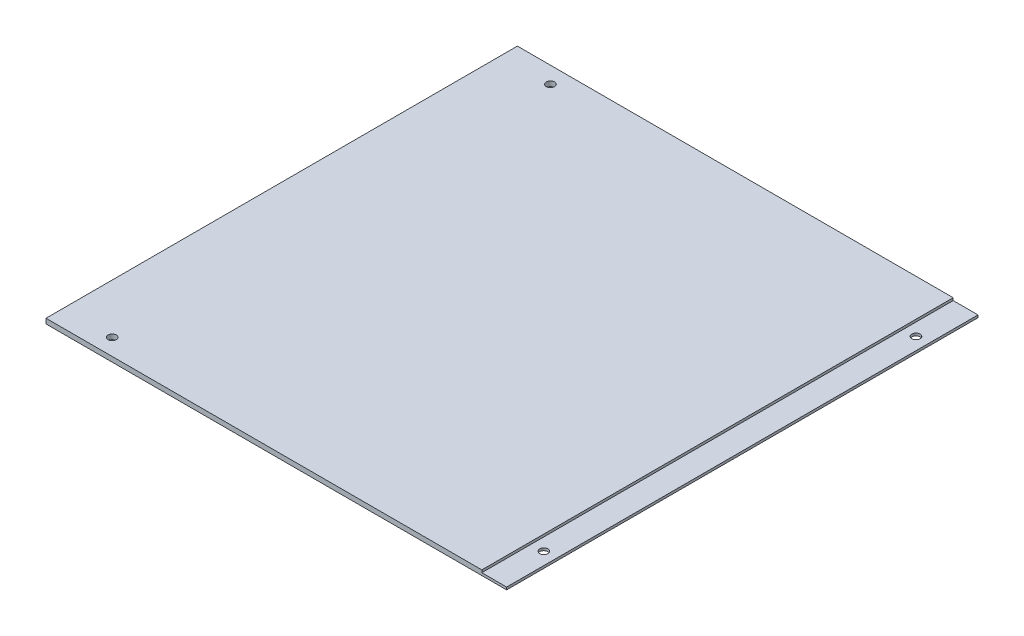
ISO-10303-21;
HEADER;
FILE_DESCRIPTION(('STEP AP214'),'2;1');
FILE_NAME('part.step','',(''),(''),'','','');
FILE_SCHEMA(('AUTOMOTIVE_DESIGN { 1 0 10303 214 1 1 1 1 }'));
ENDSEC;
DATA;
#1=APPLICATION_CONTEXT('core data for automotive mechanical design processes');
#2=APPLICATION_PROTOCOL_DEFINITION('international standard','automotive_design',2000,#1);
#3=PRODUCT_CONTEXT('',#1,'mechanical');
#4=PRODUCT('Part','Part','',(#3));
#5=PRODUCT_RELATED_PRODUCT_CATEGORY('part','',(#4));
#6=PRODUCT_DEFINITION_FORMATION('','',#4);
#7=PRODUCT_DEFINITION_CONTEXT('part definition',#1,'design');
#8=PRODUCT_DEFINITION('design','',#6,#7);
#9=PRODUCT_DEFINITION_SHAPE('','',#8);
#10=(LENGTH_UNIT() NAMED_UNIT(*) SI_UNIT(.MILLI.,.METRE.));
#11=(NAMED_UNIT(*) PLANE_ANGLE_UNIT() SI_UNIT($,.RADIAN.));
#12=(NAMED_UNIT(*) SI_UNIT($,.STERADIAN.) SOLID_ANGLE_UNIT());
#13=UNCERTAINTY_MEASURE_WITH_UNIT(LENGTH_MEASURE(1.E-05),#10,'distance_accuracy_value','');
#14=(GEOMETRIC_REPRESENTATION_CONTEXT(3) GLOBAL_UNCERTAINTY_ASSIGNED_CONTEXT((#13)) GLOBAL_UNIT_ASSIGNED_CONTEXT((#10,
#11,#12)) REPRESENTATION_CONTEXT('',''));
#15=CARTESIAN_POINT('',(0.,0.,0.));
#16=DIRECTION('',(0.,0.,1.));
#17=DIRECTION('',(1.,0.,0.));
#18=AXIS2_PLACEMENT_3D('',#15,#16,#17);
#19=CARTESIAN_POINT('',(139.25,3.,-142.5));
#20=DIRECTION('',(-1.,0.,0.));
#21=DIRECTION('',(0.,0.,1.));
#22=AXIS2_PLACEMENT_3D('',#19,#20,#21);
#23=PLANE('',#22);
#24=DIRECTION('',(0.,-1.,0.));
#25=VECTOR('',#24,1.);
#26=CARTESIAN_POINT('',(139.25,3.,-142.5));
#27=LINE('',#26,#25);
#28=CARTESIAN_POINT('',(139.25,1.5,-142.5));
#29=VERTEX_POINT('',#28);
#30=CARTESIAN_POINT('',(139.25,0.,-142.5));
#31=VERTEX_POINT('',#30);
#32=EDGE_CURVE('E11',#29,#31,#27,.T.);
#33=ORIENTED_EDGE('',*,*,#32,.F.);
#34=DIRECTION('',(0.,0.,1.));
#35=VECTOR('',#34,1.);
#36=CARTESIAN_POINT('',(139.25,1.5,-142.5));
#37=LINE('',#36,#35);
#38=CARTESIAN_POINT('',(139.25,1.5,142.5));
#39=VERTEX_POINT('',#38);
#40=EDGE_CURVE('E82',#29,#39,#37,.T.);
#41=ORIENTED_EDGE('',*,*,#40,.T.);
#42=DIRECTION('',(0.,-1.,0.));
#43=VECTOR('',#42,1.);
#44=CARTESIAN_POINT('',(139.25,3.,142.5));
#45=LINE('',#44,#43);
#46=CARTESIAN_POINT('',(139.25,0.,142.5));
#47=VERTEX_POINT('',#46);
#48=EDGE_CURVE('E75',#39,#47,#45,.T.);
#49=ORIENTED_EDGE('',*,*,#48,.T.);
#50=DIRECTION('',(0.,0.,-1.));
#51=VECTOR('',#50,1.);
#52=CARTESIAN_POINT('',(139.25,0.,-142.5));
#53=LINE('',#52,#51);
#54=EDGE_CURVE('E79',#47,#31,#53,.T.);
#55=ORIENTED_EDGE('',*,*,#54,.T.);
#56=EDGE_LOOP('',(#33,#41,#49,#55));
#57=FACE_BOUND('',#56,.T.);
#58=ADVANCED_FACE('F33',(#57),#23,.F.);
#59=CARTESIAN_POINT('',(-139.25,3.,-142.5));
#60=DIRECTION('',(0.,0.,1.));
#61=DIRECTION('',(1.,0.,0.));
#62=AXIS2_PLACEMENT_3D('',#59,#60,#61);
#63=PLANE('',#62);
#64=DIRECTION('',(0.,-1.,0.));
#65=VECTOR('',#64,1.);
#66=CARTESIAN_POINT('',(124.25,1.5,-142.5));
#67=LINE('',#66,#65);
#68=CARTESIAN_POINT('',(124.25,3.,-142.5));
#69=VERTEX_POINT('',#68);
#70=CARTESIAN_POINT('',(124.25,1.5,-142.5));
#71=VERTEX_POINT('',#70);
#72=EDGE_CURVE('E47',#69,#71,#67,.T.);
#73=ORIENTED_EDGE('',*,*,#72,.T.);
#74=DIRECTION('',(1.,0.,0.));
#75=VECTOR('',#74,1.);
#76=CARTESIAN_POINT('',(139.25,1.5,-142.5));
#77=LINE('',#76,#75);
#78=EDGE_CURVE('E118',#71,#29,#77,.T.);
#79=ORIENTED_EDGE('',*,*,#78,.T.);
#80=ORIENTED_EDGE('',*,*,#32,.T.);
#81=DIRECTION('',(-1.,0.,0.));
#82=VECTOR('',#81,1.);
#83=CARTESIAN_POINT('',(-139.25,0.,-142.5));
#84=LINE('',#83,#82);
#85=CARTESIAN_POINT('',(-139.25,0.,-142.5));
#86=VERTEX_POINT('',#85);
#87=EDGE_CURVE('E100',#31,#86,#84,.T.);
#88=ORIENTED_EDGE('',*,*,#87,.T.);
#89=DIRECTION('',(0.,-1.,0.));
#90=VECTOR('',#89,1.);
#91=CARTESIAN_POINT('',(-139.25,3.,-142.5));
#92=LINE('',#91,#90);
#93=CARTESIAN_POINT('',(-139.25,3.,-142.5));
#94=VERTEX_POINT('',#93);
#95=EDGE_CURVE('E40',#94,#86,#92,.T.);
#96=ORIENTED_EDGE('',*,*,#95,.F.);
#97=DIRECTION('',(-1.,0.,0.));
#98=VECTOR('',#97,1.);
#99=CARTESIAN_POINT('',(-139.25,3.,-142.5));
#100=LINE('',#99,#98);
#101=EDGE_CURVE('E95',#69,#94,#100,.T.);
#102=ORIENTED_EDGE('',*,*,#101,.F.);
#103=EDGE_LOOP('',(#73,#79,#80,#88,#96,#102));
#104=FACE_BOUND('',#103,.T.);
#105=ADVANCED_FACE('F115',(#104),#63,.F.);
#106=CARTESIAN_POINT('',(-139.25,3.,-142.5));
#107=DIRECTION('',(1.,0.,0.));
#108=DIRECTION('',(0.,0.,-1.));
#109=AXIS2_PLACEMENT_3D('',#106,#107,#108);
#110=PLANE('',#109);
#111=DIRECTION('',(0.,0.,1.));
#112=VECTOR('',#111,1.);
#113=CARTESIAN_POINT('',(-139.25,0.,-142.5));
#114=LINE('',#113,#112);
#115=CARTESIAN_POINT('',(-139.25,0.,142.5));
#116=VERTEX_POINT('',#115);
#117=EDGE_CURVE('E96',#86,#116,#114,.T.);
#118=ORIENTED_EDGE('',*,*,#117,.T.);
#119=DIRECTION('',(0.,-1.,0.));
#120=VECTOR('',#119,1.);
#121=CARTESIAN_POINT('',(-139.25,3.,142.5));
#122=LINE('',#121,#120);
#123=CARTESIAN_POINT('',(-139.25,3.,142.5));
#124=VERTEX_POINT('',#123);
#125=EDGE_CURVE('E85',#124,#116,#122,.T.);
#126=ORIENTED_EDGE('',*,*,#125,.F.);
#127=DIRECTION('',(0.,0.,1.));
#128=VECTOR('',#127,1.);
#129=CARTESIAN_POINT('',(-139.25,3.,-142.5));
#130=LINE('',#129,#128);
#131=EDGE_CURVE('E56',#94,#124,#130,.T.);
#132=ORIENTED_EDGE('',*,*,#131,.F.);
#133=ORIENTED_EDGE('',*,*,#95,.T.);
#134=EDGE_LOOP('',(#118,#126,#132,#133));
#135=FACE_BOUND('',#134,.T.);
#136=ADVANCED_FACE('F112',(#135),#110,.F.);
#137=CARTESIAN_POINT('',(-139.25,3.,142.5));
#138=DIRECTION('',(0.,0.,-1.));
#139=DIRECTION('',(-1.,0.,0.));
#140=AXIS2_PLACEMENT_3D('',#137,#138,#139);
#141=PLANE('',#140);
#142=ORIENTED_EDGE('',*,*,#48,.F.);
#143=DIRECTION('',(1.,0.,0.));
#144=VECTOR('',#143,1.);
#145=CARTESIAN_POINT('',(139.25,1.5,142.5));
#146=LINE('',#145,#144);
#147=CARTESIAN_POINT('',(124.25,1.5,142.5));
#148=VERTEX_POINT('',#147);
#149=EDGE_CURVE('E129',#148,#39,#146,.T.);
#150=ORIENTED_EDGE('',*,*,#149,.F.);
#151=DIRECTION('',(0.,-1.,0.));
#152=VECTOR('',#151,1.);
#153=CARTESIAN_POINT('',(124.25,1.5,142.5));
#154=LINE('',#153,#152);
#155=CARTESIAN_POINT('',(124.25,3.,142.5));
#156=VERTEX_POINT('',#155);
#157=EDGE_CURVE('E133',#156,#148,#154,.T.);
#158=ORIENTED_EDGE('',*,*,#157,.F.);
#159=DIRECTION('',(1.,0.,0.));
#160=VECTOR('',#159,1.);
#161=CARTESIAN_POINT('',(-139.25,3.,142.5));
#162=LINE('',#161,#160);
#163=EDGE_CURVE('E86',#124,#156,#162,.T.);
#164=ORIENTED_EDGE('',*,*,#163,.F.);
#165=ORIENTED_EDGE('',*,*,#125,.T.);
#166=DIRECTION('',(1.,0.,0.));
#167=VECTOR('',#166,1.);
#168=CARTESIAN_POINT('',(-139.25,0.,142.5));
#169=LINE('',#168,#167);
#170=EDGE_CURVE('E90',#116,#47,#169,.T.);
#171=ORIENTED_EDGE('',*,*,#170,.T.);
#172=EDGE_LOOP('',(#142,#150,#158,#164,#165,#171));
#173=FACE_BOUND('',#172,.T.);
#174=ADVANCED_FACE('F91',(#173),#141,.F.);
#175=CARTESIAN_POINT('',(0.,3.,0.));
#176=DIRECTION('',(0.,1.,0.));
#177=DIRECTION('',(0.,0.,1.));
#178=AXIS2_PLACEMENT_3D('',#175,#176,#177);
#179=PLANE('',#178);
#180=CARTESIAN_POINT('',(-109.25,3.,-132.5));
#181=DIRECTION('',(0.,1.,0.));
#182=DIRECTION('',(0.,0.,1.));
#183=AXIS2_PLACEMENT_3D('',#180,#181,#182);
#184=CIRCLE('',#183,2.50000000000001);
#185=CARTESIAN_POINT('',(-109.25,3.,-135.));
#186=VERTEX_POINT('',#185);
#187=EDGE_CURVE('E153',#186,#186,#184,.F.);
#188=ORIENTED_EDGE('',*,*,#187,.T.);
#189=EDGE_LOOP('',(#188));
#190=FACE_BOUND('',#189,.T.);
#191=CARTESIAN_POINT('',(-109.25,3.,132.5));
#192=DIRECTION('',(0.,1.,0.));
#193=DIRECTION('',(0.,0.,1.));
#194=AXIS2_PLACEMENT_3D('',#191,#192,#193);
#195=CIRCLE('',#194,2.50000000000001);
#196=CARTESIAN_POINT('',(-109.25,3.,130.));
#197=VERTEX_POINT('',#196);
#198=EDGE_CURVE('E146',#197,#197,#195,.F.);
#199=ORIENTED_EDGE('',*,*,#198,.T.);
#200=EDGE_LOOP('',(#199));
#201=FACE_BOUND('',#200,.T.);
#202=DIRECTION('',(0.,0.,1.));
#203=VECTOR('',#202,1.);
#204=CARTESIAN_POINT('',(124.25,3.,-142.5));
#205=LINE('',#204,#203);
#206=EDGE_CURVE('E141',#69,#156,#205,.T.);
#207=ORIENTED_EDGE('',*,*,#206,.F.);
#208=ORIENTED_EDGE('',*,*,#101,.T.);
#209=ORIENTED_EDGE('',*,*,#131,.T.);
#210=ORIENTED_EDGE('',*,*,#163,.T.);
#211=EDGE_LOOP('',(#207,#208,#209,#210));
#212=FACE_BOUND('',#211,.T.);
#213=ADVANCED_FACE('F143',(#190,#201,#212),#179,.T.);
#214=CARTESIAN_POINT('',(0.,0.,0.));
#215=DIRECTION('',(0.,1.,0.));
#216=DIRECTION('',(0.,0.,1.));
#217=AXIS2_PLACEMENT_3D('',#214,#215,#216);
#218=PLANE('',#217);
#219=CARTESIAN_POINT('',(131.75,0.,-112.5));
#220=DIRECTION('',(0.,-1.,0.));
#221=DIRECTION('',(0.,0.,-1.));
#222=AXIS2_PLACEMENT_3D('',#219,#220,#221);
#223=CIRCLE('',#222,2.5);
#224=CARTESIAN_POINT('',(131.75,0.,-115.));
#225=VERTEX_POINT('',#224);
#226=EDGE_CURVE('E161',#225,#225,#223,.T.);
#227=ORIENTED_EDGE('',*,*,#226,.F.);
#228=EDGE_LOOP('',(#227));
#229=FACE_BOUND('',#228,.T.);
#230=CARTESIAN_POINT('',(131.75,0.,112.5));
#231=DIRECTION('',(0.,-1.,0.));
#232=DIRECTION('',(0.,0.,1.));
#233=AXIS2_PLACEMENT_3D('',#230,#231,#232);
#234=CIRCLE('',#233,2.5);
#235=CARTESIAN_POINT('',(131.75,0.,110.));
#236=VERTEX_POINT('',#235);
#237=EDGE_CURVE('E162',#236,#236,#234,.T.);
#238=ORIENTED_EDGE('',*,*,#237,.F.);
#239=EDGE_LOOP('',(#238));
#240=FACE_BOUND('',#239,.T.);
#241=CARTESIAN_POINT('',(-109.25,0.,-132.5));
#242=DIRECTION('',(0.,-1.,0.));
#243=DIRECTION('',(0.,0.,-1.));
#244=AXIS2_PLACEMENT_3D('',#241,#242,#243);
#245=CIRCLE('',#244,2.50000000000001);
#246=CARTESIAN_POINT('',(-109.25,0.,-135.));
#247=VERTEX_POINT('',#246);
#248=EDGE_CURVE('E136',#247,#247,#245,.T.);
#249=ORIENTED_EDGE('',*,*,#248,.F.);
#250=EDGE_LOOP('',(#249));
#251=FACE_BOUND('',#250,.T.);
#252=CARTESIAN_POINT('',(-109.25,0.,132.5));
#253=DIRECTION('',(0.,-1.,0.));
#254=DIRECTION('',(0.,0.,-1.));
#255=AXIS2_PLACEMENT_3D('',#252,#253,#254);
#256=CIRCLE('',#255,2.50000000000001);
#257=CARTESIAN_POINT('',(-109.25,0.,130.));
#258=VERTEX_POINT('',#257);
#259=EDGE_CURVE('E149',#258,#258,#256,.T.);
#260=ORIENTED_EDGE('',*,*,#259,.F.);
#261=EDGE_LOOP('',(#260));
#262=FACE_BOUND('',#261,.T.);
#263=ORIENTED_EDGE('',*,*,#54,.F.);
#264=ORIENTED_EDGE('',*,*,#170,.F.);
#265=ORIENTED_EDGE('',*,*,#117,.F.);
#266=ORIENTED_EDGE('',*,*,#87,.F.);
#267=EDGE_LOOP('',(#263,#264,#265,#266));
#268=FACE_BOUND('',#267,.T.);
#269=ADVANCED_FACE('F99',(#229,#240,#251,#262,#268),#218,.F.);
#270=CARTESIAN_POINT('',(139.25,1.5,-142.5));
#271=DIRECTION('',(0.,-1.,0.));
#272=DIRECTION('',(1.,0.,0.));
#273=AXIS2_PLACEMENT_3D('',#270,#271,#272);
#274=PLANE('',#273);
#275=CARTESIAN_POINT('',(131.75,1.5,-112.5));
#276=DIRECTION('',(0.,-1.,0.));
#277=DIRECTION('',(1.,0.,0.));
#278=AXIS2_PLACEMENT_3D('',#275,#276,#277);
#279=CIRCLE('',#278,2.5);
#280=CARTESIAN_POINT('',(131.75,1.5,-115.));
#281=VERTEX_POINT('',#280);
#282=EDGE_CURVE('E150',#281,#281,#279,.F.);
#283=ORIENTED_EDGE('',*,*,#282,.F.);
#284=EDGE_LOOP('',(#283));
#285=FACE_BOUND('',#284,.T.);
#286=CARTESIAN_POINT('',(131.75,1.5,112.5));
#287=DIRECTION('',(0.,-1.,0.));
#288=DIRECTION('',(1.,0.,0.));
#289=AXIS2_PLACEMENT_3D('',#286,#287,#288);
#290=CIRCLE('',#289,2.5);
#291=CARTESIAN_POINT('',(131.75,1.5,110.));
#292=VERTEX_POINT('',#291);
#293=EDGE_CURVE('E158',#292,#292,#290,.F.);
#294=ORIENTED_EDGE('',*,*,#293,.F.);
#295=EDGE_LOOP('',(#294));
#296=FACE_BOUND('',#295,.T.);
#297=ORIENTED_EDGE('',*,*,#149,.T.);
#298=ORIENTED_EDGE('',*,*,#40,.F.);
#299=ORIENTED_EDGE('',*,*,#78,.F.);
#300=DIRECTION('',(0.,0.,1.));
#301=VECTOR('',#300,1.);
#302=CARTESIAN_POINT('',(124.25,1.5,-142.5));
#303=LINE('',#302,#301);
#304=EDGE_CURVE('E103',#71,#148,#303,.T.);
#305=ORIENTED_EDGE('',*,*,#304,.T.);
#306=EDGE_LOOP('',(#297,#298,#299,#305));
#307=FACE_BOUND('',#306,.T.);
#308=ADVANCED_FACE('F130',(#285,#296,#307),#274,.F.);
#309=CARTESIAN_POINT('',(124.25,1.5,-142.5));
#310=DIRECTION('',(-1.,0.,0.));
#311=DIRECTION('',(0.,0.,1.));
#312=AXIS2_PLACEMENT_3D('',#309,#310,#311);
#313=PLANE('',#312);
#314=ORIENTED_EDGE('',*,*,#157,.T.);
#315=ORIENTED_EDGE('',*,*,#304,.F.);
#316=ORIENTED_EDGE('',*,*,#72,.F.);
#317=ORIENTED_EDGE('',*,*,#206,.T.);
#318=EDGE_LOOP('',(#314,#315,#316,#317));
#319=FACE_BOUND('',#318,.T.);
#320=ADVANCED_FACE('F144',(#319),#313,.F.);
#321=CARTESIAN_POINT('',(-109.25,3.001,132.5));
#322=DIRECTION('',(0.,-1.,0.));
#323=DIRECTION('',(0.,0.,-1.));
#324=AXIS2_PLACEMENT_3D('',#321,#322,#323);
#325=CYLINDRICAL_SURFACE('',#324,2.50000000000001);
#326=CARTESIAN_POINT('',(-109.25,3.,130.));
#327=CARTESIAN_POINT('',(-109.25,2.96875,130.));
#328=CARTESIAN_POINT('',(-109.25,2.9375,130.));
#329=CARTESIAN_POINT('',(-109.25,2.875,130.));
#330=CARTESIAN_POINT('',(-109.25,2.84375,130.));
#331=CARTESIAN_POINT('',(-109.25,2.78125,130.));
#332=CARTESIAN_POINT('',(-109.25,2.75,130.));
#333=CARTESIAN_POINT('',(-109.25,2.6875,130.));
#334=CARTESIAN_POINT('',(-109.25,2.65625,130.));
#335=CARTESIAN_POINT('',(-109.25,2.59375,130.));
#336=CARTESIAN_POINT('',(-109.25,2.5625,130.));
#337=CARTESIAN_POINT('',(-109.25,2.5,130.));
#338=CARTESIAN_POINT('',(-109.25,2.46875,130.));
#339=CARTESIAN_POINT('',(-109.25,2.40625,130.));
#340=CARTESIAN_POINT('',(-109.25,2.375,130.));
#341=CARTESIAN_POINT('',(-109.25,2.3125,130.));
#342=CARTESIAN_POINT('',(-109.25,2.28125,130.));
#343=CARTESIAN_POINT('',(-109.25,2.21875,130.));
#344=CARTESIAN_POINT('',(-109.25,2.1875,130.));
#345=CARTESIAN_POINT('',(-109.25,2.125,130.));
#346=CARTESIAN_POINT('',(-109.25,2.09375,130.));
#347=CARTESIAN_POINT('',(-109.25,2.03125,130.));
#348=CARTESIAN_POINT('',(-109.25,2.,130.));
#349=CARTESIAN_POINT('',(-109.25,1.9375,130.));
#350=CARTESIAN_POINT('',(-109.25,1.90625,130.));
#351=CARTESIAN_POINT('',(-109.25,1.84375,130.));
#352=CARTESIAN_POINT('',(-109.25,1.8125,130.));
#353=CARTESIAN_POINT('',(-109.25,1.75,130.));
#354=CARTESIAN_POINT('',(-109.25,1.71875,130.));
#355=CARTESIAN_POINT('',(-109.25,1.65625,130.));
#356=CARTESIAN_POINT('',(-109.25,1.625,130.));
#357=CARTESIAN_POINT('',(-109.25,1.5625,130.));
#358=CARTESIAN_POINT('',(-109.25,1.53125,130.));
#359=CARTESIAN_POINT('',(-109.25,1.46875,130.));
#360=CARTESIAN_POINT('',(-109.25,1.4375,130.));
#361=CARTESIAN_POINT('',(-109.25,1.375,130.));
#362=CARTESIAN_POINT('',(-109.25,1.34375,130.));
#363=CARTESIAN_POINT('',(-109.25,1.28125,130.));
#364=CARTESIAN_POINT('',(-109.25,1.25,130.));
#365=CARTESIAN_POINT('',(-109.25,1.1875,130.));
#366=CARTESIAN_POINT('',(-109.25,1.15625,130.));
#367=CARTESIAN_POINT('',(-109.25,1.09375,130.));
#368=CARTESIAN_POINT('',(-109.25,1.0625,130.));
#369=CARTESIAN_POINT('',(-109.25,1.,130.));
#370=CARTESIAN_POINT('',(-109.25,0.96875,130.));
#371=CARTESIAN_POINT('',(-109.25,0.90625,130.));
#372=CARTESIAN_POINT('',(-109.25,0.875,130.));
#373=CARTESIAN_POINT('',(-109.25,0.8125,130.));
#374=CARTESIAN_POINT('',(-109.25,0.78125,130.));
#375=CARTESIAN_POINT('',(-109.25,0.71875,130.));
#376=CARTESIAN_POINT('',(-109.25,0.6875,130.));
#377=CARTESIAN_POINT('',(-109.25,0.625,130.));
#378=CARTESIAN_POINT('',(-109.25,0.59375,130.));
#379=CARTESIAN_POINT('',(-109.25,0.53125,130.));
#380=CARTESIAN_POINT('',(-109.25,0.5,130.));
#381=CARTESIAN_POINT('',(-109.25,0.4375,130.));
#382=CARTESIAN_POINT('',(-109.25,0.40625,130.));
#383=CARTESIAN_POINT('',(-109.25,0.34375,130.));
#384=CARTESIAN_POINT('',(-109.25,0.3125,130.));
#385=CARTESIAN_POINT('',(-109.25,0.25,130.));
#386=CARTESIAN_POINT('',(-109.25,0.21875,130.));
#387=CARTESIAN_POINT('',(-109.25,0.156250000000001,130.));
#388=CARTESIAN_POINT('',(-109.25,0.125000000000001,130.));
#389=CARTESIAN_POINT('',(-109.25,0.0625000000000005,130.));
#390=CARTESIAN_POINT('',(-109.25,0.0312500000000005,130.));
#391=CARTESIAN_POINT('',(-109.25,0.,130.));
#392=B_SPLINE_CURVE_WITH_KNOTS('',3,(#326,#327,#328,#329,#330,#331,#332,#333,#334,#335,#336,
#337,#338,#339,#340,#341,#342,#343,#344,#345,#346,#347,#348,#349,#350,#351,#352,#353,#354,#355,
#356,#357,#358,#359,#360,#361,#362,#363,#364,#365,#366,#367,#368,#369,#370,#371,#372,#373,#374,
#375,#376,#377,#378,#379,#380,#381,#382,#383,#384,#385,#386,#387,#388,#389,#390,#391),
.UNSPECIFIED.,.F.,.F.,(4,2,2,2,2,2,2,2,2,2,2,2,2,2,2,2,2,2,2,2,2,2,2,2,2,2,2,2,2,2,2,2,4),(0.,
0.0937499999999997,0.1875,0.28125,0.375,0.46875,0.5625,0.65625,0.749999999999999,
0.843749999999999,0.9375,1.03125,1.125,1.21875,1.3125,1.40625,1.5,1.59375,1.6875,1.78125,1.875,
1.96875,2.0625,2.15625,2.25,2.34375,2.4375,2.53125,2.625,2.71875,2.8125,2.90625,3.),.UNSPECIFIED.);
#393=EDGE_CURVE('BSEAM182',#197,#258,#392,.T.);
#394=ORIENTED_EDGE('',*,*,#198,.F.);
#395=ORIENTED_EDGE('',*,*,#259,.T.);
#396=ORIENTED_EDGE('',*,*,#393,.T.);
#397=ORIENTED_EDGE('',*,*,#393,.F.);
#398=EDGE_LOOP('',(#394,#396,#395,#397));
#399=FACE_BOUND('',#398,.T.);
#400=ADVANCED_FACE('F182',(#399),#325,.F.);
#401=CARTESIAN_POINT('',(-109.25,3.001,-132.5));
#402=DIRECTION('',(0.,-1.,0.));
#403=DIRECTION('',(0.,0.,-1.));
#404=AXIS2_PLACEMENT_3D('',#401,#402,#403);
#405=CYLINDRICAL_SURFACE('',#404,2.50000000000001);
#406=CARTESIAN_POINT('',(-109.25,3.,-135.));
#407=CARTESIAN_POINT('',(-109.25,2.96875,-135.));
#408=CARTESIAN_POINT('',(-109.25,2.9375,-135.));
#409=CARTESIAN_POINT('',(-109.25,2.875,-135.));
#410=CARTESIAN_POINT('',(-109.25,2.84375,-135.));
#411=CARTESIAN_POINT('',(-109.25,2.78125,-135.));
#412=CARTESIAN_POINT('',(-109.25,2.75,-135.));
#413=CARTESIAN_POINT('',(-109.25,2.6875,-135.));
#414=CARTESIAN_POINT('',(-109.25,2.65625,-135.));
#415=CARTESIAN_POINT('',(-109.25,2.59375,-135.));
#416=CARTESIAN_POINT('',(-109.25,2.5625,-135.));
#417=CARTESIAN_POINT('',(-109.25,2.5,-135.));
#418=CARTESIAN_POINT('',(-109.25,2.46875,-135.));
#419=CARTESIAN_POINT('',(-109.25,2.40625,-135.));
#420=CARTESIAN_POINT('',(-109.25,2.375,-135.));
#421=CARTESIAN_POINT('',(-109.25,2.3125,-135.));
#422=CARTESIAN_POINT('',(-109.25,2.28125,-135.));
#423=CARTESIAN_POINT('',(-109.25,2.21875,-135.));
#424=CARTESIAN_POINT('',(-109.25,2.1875,-135.));
#425=CARTESIAN_POINT('',(-109.25,2.125,-135.));
#426=CARTESIAN_POINT('',(-109.25,2.09375,-135.));
#427=CARTESIAN_POINT('',(-109.25,2.03125,-135.));
#428=CARTESIAN_POINT('',(-109.25,2.,-135.));
#429=CARTESIAN_POINT('',(-109.25,1.9375,-135.));
#430=CARTESIAN_POINT('',(-109.25,1.90625,-135.));
#431=CARTESIAN_POINT('',(-109.25,1.84375,-135.));
#432=CARTESIAN_POINT('',(-109.25,1.8125,-135.));
#433=CARTESIAN_POINT('',(-109.25,1.75,-135.));
#434=CARTESIAN_POINT('',(-109.25,1.71875,-135.));
#435=CARTESIAN_POINT('',(-109.25,1.65625,-135.));
#436=CARTESIAN_POINT('',(-109.25,1.625,-135.));
#437=CARTESIAN_POINT('',(-109.25,1.5625,-135.));
#438=CARTESIAN_POINT('',(-109.25,1.53125,-135.));
#439=CARTESIAN_POINT('',(-109.25,1.46875,-135.));
#440=CARTESIAN_POINT('',(-109.25,1.4375,-135.));
#441=CARTESIAN_POINT('',(-109.25,1.375,-135.));
#442=CARTESIAN_POINT('',(-109.25,1.34375,-135.));
#443=CARTESIAN_POINT('',(-109.25,1.28125,-135.));
#444=CARTESIAN_POINT('',(-109.25,1.25,-135.));
#445=CARTESIAN_POINT('',(-109.25,1.1875,-135.));
#446=CARTESIAN_POINT('',(-109.25,1.15625,-135.));
#447=CARTESIAN_POINT('',(-109.25,1.09375,-135.));
#448=CARTESIAN_POINT('',(-109.25,1.0625,-135.));
#449=CARTESIAN_POINT('',(-109.25,1.,-135.));
#450=CARTESIAN_POINT('',(-109.25,0.96875,-135.));
#451=CARTESIAN_POINT('',(-109.25,0.90625,-135.));
#452=CARTESIAN_POINT('',(-109.25,0.875,-135.));
#453=CARTESIAN_POINT('',(-109.25,0.8125,-135.));
#454=CARTESIAN_POINT('',(-109.25,0.78125,-135.));
#455=CARTESIAN_POINT('',(-109.25,0.71875,-135.));
#456=CARTESIAN_POINT('',(-109.25,0.6875,-135.));
#457=CARTESIAN_POINT('',(-109.25,0.625,-135.));
#458=CARTESIAN_POINT('',(-109.25,0.59375,-135.));
#459=CARTESIAN_POINT('',(-109.25,0.53125,-135.));
#460=CARTESIAN_POINT('',(-109.25,0.5,-135.));
#461=CARTESIAN_POINT('',(-109.25,0.4375,-135.));
#462=CARTESIAN_POINT('',(-109.25,0.40625,-135.));
#463=CARTESIAN_POINT('',(-109.25,0.34375,-135.));
#464=CARTESIAN_POINT('',(-109.25,0.3125,-135.));
#465=CARTESIAN_POINT('',(-109.25,0.25,-135.));
#466=CARTESIAN_POINT('',(-109.25,0.21875,-135.));
#467=CARTESIAN_POINT('',(-109.25,0.156250000000001,-135.));
#468=CARTESIAN_POINT('',(-109.25,0.125000000000001,-135.));
#469=CARTESIAN_POINT('',(-109.25,0.0625000000000005,-135.));
#470=CARTESIAN_POINT('',(-109.25,0.0312500000000005,-135.));
#471=CARTESIAN_POINT('',(-109.25,0.,-135.));
#472=B_SPLINE_CURVE_WITH_KNOTS('',3,(#406,#407,#408,#409,#410,#411,#412,#413,#414,#415,#416,
#417,#418,#419,#420,#421,#422,#423,#424,#425,#426,#427,#428,#429,#430,#431,#432,#433,#434,#435,
#436,#437,#438,#439,#440,#441,#442,#443,#444,#445,#446,#447,#448,#449,#450,#451,#452,#453,#454,
#455,#456,#457,#458,#459,#460,#461,#462,#463,#464,#465,#466,#467,#468,#469,#470,#471),
.UNSPECIFIED.,.F.,.F.,(4,2,2,2,2,2,2,2,2,2,2,2,2,2,2,2,2,2,2,2,2,2,2,2,2,2,2,2,2,2,2,2,4),(0.,
0.0937499999999997,0.1875,0.28125,0.375,0.46875,0.5625,0.65625,0.749999999999999,
0.843749999999999,0.9375,1.03125,1.125,1.21875,1.3125,1.40625,1.5,1.59375,1.6875,1.78125,1.875,
1.96875,2.0625,2.15625,2.25,2.34375,2.4375,2.53125,2.625,2.71875,2.8125,2.90625,3.),.UNSPECIFIED.);
#473=EDGE_CURVE('BSEAM184',#186,#247,#472,.T.);
#474=ORIENTED_EDGE('',*,*,#187,.F.);
#475=ORIENTED_EDGE('',*,*,#248,.T.);
#476=ORIENTED_EDGE('',*,*,#473,.T.);
#477=ORIENTED_EDGE('',*,*,#473,.F.);
#478=EDGE_LOOP('',(#474,#476,#475,#477));
#479=FACE_BOUND('',#478,.T.);
#480=ADVANCED_FACE('F184',(#479),#405,.F.);
#481=CARTESIAN_POINT('',(131.75,3.001,112.5));
#482=DIRECTION('',(0.,-1.,0.));
#483=DIRECTION('',(0.,0.,-1.));
#484=AXIS2_PLACEMENT_3D('',#481,#482,#483);
#485=CYLINDRICAL_SURFACE('',#484,2.5);
#486=CARTESIAN_POINT('',(131.75,0.,110.));
#487=CARTESIAN_POINT('',(131.75,0.0156250000000004,110.));
#488=CARTESIAN_POINT('',(131.75,0.0312500000000005,110.));
#489=CARTESIAN_POINT('',(131.75,0.0625000000000005,110.));
#490=CARTESIAN_POINT('',(131.75,0.0781250000000005,110.));
#491=CARTESIAN_POINT('',(131.75,0.109375000000001,110.));
#492=CARTESIAN_POINT('',(131.75,0.125000000000001,110.));
#493=CARTESIAN_POINT('',(131.75,0.15625,110.));
#494=CARTESIAN_POINT('',(131.75,0.171875,110.));
#495=CARTESIAN_POINT('',(131.75,0.203125,110.));
#496=CARTESIAN_POINT('',(131.75,0.21875,110.));
#497=CARTESIAN_POINT('',(131.75,0.25,110.));
#498=CARTESIAN_POINT('',(131.75,0.265625,110.));
#499=CARTESIAN_POINT('',(131.75,0.296875,110.));
#500=CARTESIAN_POINT('',(131.75,0.3125,110.));
#501=CARTESIAN_POINT('',(131.75,0.34375,110.));
#502=CARTESIAN_POINT('',(131.75,0.359375,110.));
#503=CARTESIAN_POINT('',(131.75,0.390625,110.));
#504=CARTESIAN_POINT('',(131.75,0.40625,110.));
#505=CARTESIAN_POINT('',(131.75,0.4375,110.));
#506=CARTESIAN_POINT('',(131.75,0.453125,110.));
#507=CARTESIAN_POINT('',(131.75,0.484375,110.));
#508=CARTESIAN_POINT('',(131.75,0.5,110.));
#509=CARTESIAN_POINT('',(131.75,0.53125,110.));
#510=CARTESIAN_POINT('',(131.75,0.546875,110.));
#511=CARTESIAN_POINT('',(131.75,0.578125,110.));
#512=CARTESIAN_POINT('',(131.75,0.59375,110.));
#513=CARTESIAN_POINT('',(131.75,0.625,110.));
#514=CARTESIAN_POINT('',(131.75,0.640625,110.));
#515=CARTESIAN_POINT('',(131.75,0.671875,110.));
#516=CARTESIAN_POINT('',(131.75,0.6875,110.));
#517=CARTESIAN_POINT('',(131.75,0.71875,110.));
#518=CARTESIAN_POINT('',(131.75,0.734375,110.));
#519=CARTESIAN_POINT('',(131.75,0.765625,110.));
#520=CARTESIAN_POINT('',(131.75,0.78125,110.));
#521=CARTESIAN_POINT('',(131.75,0.8125,110.));
#522=CARTESIAN_POINT('',(131.75,0.828125,110.));
#523=CARTESIAN_POINT('',(131.75,0.859375,110.));
#524=CARTESIAN_POINT('',(131.75,0.875,110.));
#525=CARTESIAN_POINT('',(131.75,0.90625,110.));
#526=CARTESIAN_POINT('',(131.75,0.921875,110.));
#527=CARTESIAN_POINT('',(131.75,0.953125,110.));
#528=CARTESIAN_POINT('',(131.75,0.96875,110.));
#529=CARTESIAN_POINT('',(131.75,1.,110.));
#530=CARTESIAN_POINT('',(131.75,1.015625,110.));
#531=CARTESIAN_POINT('',(131.75,1.046875,110.));
#532=CARTESIAN_POINT('',(131.75,1.0625,110.));
#533=CARTESIAN_POINT('',(131.75,1.09375,110.));
#534=CARTESIAN_POINT('',(131.75,1.109375,110.));
#535=CARTESIAN_POINT('',(131.75,1.140625,110.));
#536=CARTESIAN_POINT('',(131.75,1.15625,110.));
#537=CARTESIAN_POINT('',(131.75,1.1875,110.));
#538=CARTESIAN_POINT('',(131.75,1.203125,110.));
#539=CARTESIAN_POINT('',(131.75,1.234375,110.));
#540=CARTESIAN_POINT('',(131.75,1.25,110.));
#541=CARTESIAN_POINT('',(131.75,1.28125,110.));
#542=CARTESIAN_POINT('',(131.75,1.296875,110.));
#543=CARTESIAN_POINT('',(131.75,1.328125,110.));
#544=CARTESIAN_POINT('',(131.75,1.34375,110.));
#545=CARTESIAN_POINT('',(131.75,1.375,110.));
#546=CARTESIAN_POINT('',(131.75,1.390625,110.));
#547=CARTESIAN_POINT('',(131.75,1.421875,110.));
#548=CARTESIAN_POINT('',(131.75,1.4375,110.));
#549=CARTESIAN_POINT('',(131.75,1.46875,110.));
#550=CARTESIAN_POINT('',(131.75,1.484375,110.));
#551=CARTESIAN_POINT('',(131.75,1.5,110.));
#552=B_SPLINE_CURVE_WITH_KNOTS('',3,(#486,#487,#488,#489,#490,#491,#492,#493,#494,#495,#496,
#497,#498,#499,#500,#501,#502,#503,#504,#505,#506,#507,#508,#509,#510,#511,#512,#513,#514,#515,
#516,#517,#518,#519,#520,#521,#522,#523,#524,#525,#526,#527,#528,#529,#530,#531,#532,#533,#534,
#535,#536,#537,#538,#539,#540,#541,#542,#543,#544,#545,#546,#547,#548,#549,#550,#551),
.UNSPECIFIED.,.F.,.F.,(4,2,2,2,2,2,2,2,2,2,2,2,2,2,2,2,2,2,2,2,2,2,2,2,2,2,2,2,2,2,2,2,4),(0.,
0.046875,0.0937500000000001,0.140625,0.1875,0.234375,0.28125,0.328125,0.375,0.421875,0.46875,
0.515625,0.5625,0.609375,0.65625,0.703125,0.75,0.796874999999999,0.843749999999999,
0.890624999999999,0.9375,0.984374999999999,1.03125,1.078125,1.125,1.171875,1.21875,1.265625,
1.3125,1.359375,1.40625,1.453125,1.5),.UNSPECIFIED.);
#553=EDGE_CURVE('BSEAM191',#236,#292,#552,.T.);
#554=ORIENTED_EDGE('',*,*,#237,.T.);
#555=ORIENTED_EDGE('',*,*,#293,.T.);
#556=ORIENTED_EDGE('',*,*,#553,.T.);
#557=ORIENTED_EDGE('',*,*,#553,.F.);
#558=EDGE_LOOP('',(#554,#556,#555,#557));
#559=FACE_BOUND('',#558,.T.);
#560=ADVANCED_FACE('F191',(#559),#485,.F.);
#561=CARTESIAN_POINT('',(131.75,3.001,-112.5));
#562=DIRECTION('',(0.,-1.,0.));
#563=DIRECTION('',(0.,0.,-1.));
#564=AXIS2_PLACEMENT_3D('',#561,#562,#563);
#565=CYLINDRICAL_SURFACE('',#564,2.5);
#566=CARTESIAN_POINT('',(131.75,0.,-115.));
#567=CARTESIAN_POINT('',(131.75,0.0156250000000004,-115.));
#568=CARTESIAN_POINT('',(131.75,0.0312500000000005,-115.));
#569=CARTESIAN_POINT('',(131.75,0.0625000000000005,-115.));
#570=CARTESIAN_POINT('',(131.75,0.0781250000000005,-115.));
#571=CARTESIAN_POINT('',(131.75,0.109375000000001,-115.));
#572=CARTESIAN_POINT('',(131.75,0.125000000000001,-115.));
#573=CARTESIAN_POINT('',(131.75,0.15625,-115.));
#574=CARTESIAN_POINT('',(131.75,0.171875,-115.));
#575=CARTESIAN_POINT('',(131.75,0.203125,-115.));
#576=CARTESIAN_POINT('',(131.75,0.21875,-115.));
#577=CARTESIAN_POINT('',(131.75,0.25,-115.));
#578=CARTESIAN_POINT('',(131.75,0.265625,-115.));
#579=CARTESIAN_POINT('',(131.75,0.296875,-115.));
#580=CARTESIAN_POINT('',(131.75,0.3125,-115.));
#581=CARTESIAN_POINT('',(131.75,0.34375,-115.));
#582=CARTESIAN_POINT('',(131.75,0.359375,-115.));
#583=CARTESIAN_POINT('',(131.75,0.390625,-115.));
#584=CARTESIAN_POINT('',(131.75,0.40625,-115.));
#585=CARTESIAN_POINT('',(131.75,0.4375,-115.));
#586=CARTESIAN_POINT('',(131.75,0.453125,-115.));
#587=CARTESIAN_POINT('',(131.75,0.484375,-115.));
#588=CARTESIAN_POINT('',(131.75,0.5,-115.));
#589=CARTESIAN_POINT('',(131.75,0.53125,-115.));
#590=CARTESIAN_POINT('',(131.75,0.546875,-115.));
#591=CARTESIAN_POINT('',(131.75,0.578125,-115.));
#592=CARTESIAN_POINT('',(131.75,0.59375,-115.));
#593=CARTESIAN_POINT('',(131.75,0.625,-115.));
#594=CARTESIAN_POINT('',(131.75,0.640625,-115.));
#595=CARTESIAN_POINT('',(131.75,0.671875,-115.));
#596=CARTESIAN_POINT('',(131.75,0.6875,-115.));
#597=CARTESIAN_POINT('',(131.75,0.71875,-115.));
#598=CARTESIAN_POINT('',(131.75,0.734375,-115.));
#599=CARTESIAN_POINT('',(131.75,0.765625,-115.));
#600=CARTESIAN_POINT('',(131.75,0.78125,-115.));
#601=CARTESIAN_POINT('',(131.75,0.8125,-115.));
#602=CARTESIAN_POINT('',(131.75,0.828125,-115.));
#603=CARTESIAN_POINT('',(131.75,0.859375,-115.));
#604=CARTESIAN_POINT('',(131.75,0.875,-115.));
#605=CARTESIAN_POINT('',(131.75,0.90625,-115.));
#606=CARTESIAN_POINT('',(131.75,0.921875,-115.));
#607=CARTESIAN_POINT('',(131.75,0.953125,-115.));
#608=CARTESIAN_POINT('',(131.75,0.96875,-115.));
#609=CARTESIAN_POINT('',(131.75,1.,-115.));
#610=CARTESIAN_POINT('',(131.75,1.015625,-115.));
#611=CARTESIAN_POINT('',(131.75,1.046875,-115.));
#612=CARTESIAN_POINT('',(131.75,1.0625,-115.));
#613=CARTESIAN_POINT('',(131.75,1.09375,-115.));
#614=CARTESIAN_POINT('',(131.75,1.109375,-115.));
#615=CARTESIAN_POINT('',(131.75,1.140625,-115.));
#616=CARTESIAN_POINT('',(131.75,1.15625,-115.));
#617=CARTESIAN_POINT('',(131.75,1.1875,-115.));
#618=CARTESIAN_POINT('',(131.75,1.203125,-115.));
#619=CARTESIAN_POINT('',(131.75,1.234375,-115.));
#620=CARTESIAN_POINT('',(131.75,1.25,-115.));
#621=CARTESIAN_POINT('',(131.75,1.28125,-115.));
#622=CARTESIAN_POINT('',(131.75,1.296875,-115.));
#623=CARTESIAN_POINT('',(131.75,1.328125,-115.));
#624=CARTESIAN_POINT('',(131.75,1.34375,-115.));
#625=CARTESIAN_POINT('',(131.75,1.375,-115.));
#626=CARTESIAN_POINT('',(131.75,1.390625,-115.));
#627=CARTESIAN_POINT('',(131.75,1.421875,-115.));
#628=CARTESIAN_POINT('',(131.75,1.4375,-115.));
#629=CARTESIAN_POINT('',(131.75,1.46875,-115.));
#630=CARTESIAN_POINT('',(131.75,1.484375,-115.));
#631=CARTESIAN_POINT('',(131.75,1.5,-115.));
#632=B_SPLINE_CURVE_WITH_KNOTS('',3,(#566,#567,#568,#569,#570,#571,#572,#573,#574,#575,#576,
#577,#578,#579,#580,#581,#582,#583,#584,#585,#586,#587,#588,#589,#590,#591,#592,#593,#594,#595,
#596,#597,#598,#599,#600,#601,#602,#603,#604,#605,#606,#607,#608,#609,#610,#611,#612,#613,#614,
#615,#616,#617,#618,#619,#620,#621,#622,#623,#624,#625,#626,#627,#628,#629,#630,#631),
.UNSPECIFIED.,.F.,.F.,(4,2,2,2,2,2,2,2,2,2,2,2,2,2,2,2,2,2,2,2,2,2,2,2,2,2,2,2,2,2,2,2,4),(0.,
0.046875,0.0937500000000001,0.140625,0.1875,0.234375,0.28125,0.328125,0.375,0.421875,0.46875,
0.515625,0.5625,0.609375,0.65625,0.703125,0.75,0.796874999999999,0.843749999999999,
0.890624999999999,0.9375,0.984374999999999,1.03125,1.078125,1.125,1.171875,1.21875,1.265625,
1.3125,1.359375,1.40625,1.453125,1.5),.UNSPECIFIED.);
#633=EDGE_CURVE('BSEAM170',#225,#281,#632,.T.);
#634=ORIENTED_EDGE('',*,*,#226,.T.);
#635=ORIENTED_EDGE('',*,*,#282,.T.);
#636=ORIENTED_EDGE('',*,*,#633,.T.);
#637=ORIENTED_EDGE('',*,*,#633,.F.);
#638=EDGE_LOOP('',(#634,#636,#635,#637));
#639=FACE_BOUND('',#638,.T.);
#640=ADVANCED_FACE('F170',(#639),#565,.F.);
#641=CLOSED_SHELL('',(#58,#105,#136,#174,#213,#269,#308,#320,#400,#480,#560,#640));
#642=MANIFOLD_SOLID_BREP('B2',#641);
#643=ADVANCED_BREP_SHAPE_REPRESENTATION('',(#18,#642),#14);
#644=SHAPE_DEFINITION_REPRESENTATION(#9,#643);
ENDSEC;
END-ISO-10303-21;
